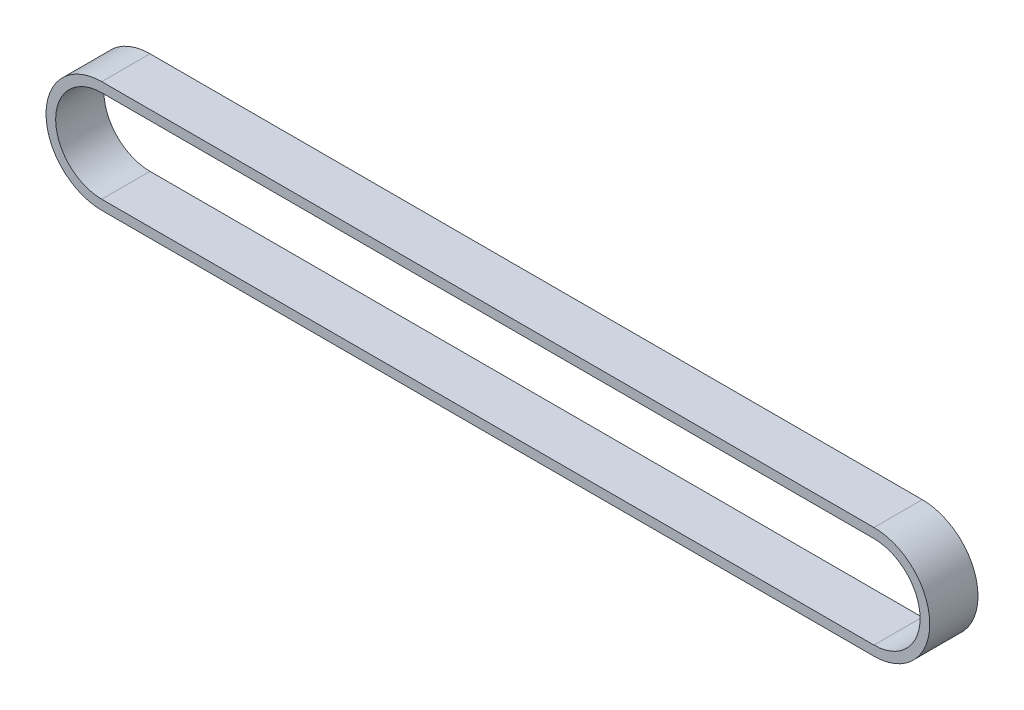
ISO-10303-21;
HEADER;
FILE_DESCRIPTION(('STEP AP214'),'2;1');
FILE_NAME('part.step','',(''),(''),'','','');
FILE_SCHEMA(('AUTOMOTIVE_DESIGN { 1 0 10303 214 1 1 1 1 }'));
ENDSEC;
DATA;
#1=APPLICATION_CONTEXT('core data for automotive mechanical design processes');
#2=APPLICATION_PROTOCOL_DEFINITION('international standard','automotive_design',2000,#1);
#3=PRODUCT_CONTEXT('',#1,'mechanical');
#4=PRODUCT('Part','Part','',(#3));
#5=PRODUCT_RELATED_PRODUCT_CATEGORY('part','',(#4));
#6=PRODUCT_DEFINITION_FORMATION('','',#4);
#7=PRODUCT_DEFINITION_CONTEXT('part definition',#1,'design');
#8=PRODUCT_DEFINITION('design','',#6,#7);
#9=PRODUCT_DEFINITION_SHAPE('','',#8);
#10=(LENGTH_UNIT() NAMED_UNIT(*) SI_UNIT(.MILLI.,.METRE.));
#11=(NAMED_UNIT(*) PLANE_ANGLE_UNIT() SI_UNIT($,.RADIAN.));
#12=(NAMED_UNIT(*) SI_UNIT($,.STERADIAN.) SOLID_ANGLE_UNIT());
#13=UNCERTAINTY_MEASURE_WITH_UNIT(LENGTH_MEASURE(1.E-05),#10,'distance_accuracy_value','');
#14=(GEOMETRIC_REPRESENTATION_CONTEXT(3) GLOBAL_UNCERTAINTY_ASSIGNED_CONTEXT((#13)) GLOBAL_UNIT_ASSIGNED_CONTEXT((#10,
#11,#12)) REPRESENTATION_CONTEXT('',''));
#15=CARTESIAN_POINT('',(0.,0.,0.));
#16=DIRECTION('',(0.,0.,1.));
#17=DIRECTION('',(1.,0.,0.));
#18=AXIS2_PLACEMENT_3D('',#15,#16,#17);
#19=CARTESIAN_POINT('',(0.,0.,7.5));
#20=DIRECTION('',(0.,0.,-1.));
#21=DIRECTION('',(-1.,0.,0.));
#22=AXIS2_PLACEMENT_3D('',#19,#20,#21);
#23=PLANE('',#22);
#24=CARTESIAN_POINT('',(0.,0.,7.5));
#25=DIRECTION('',(0.,0.,-1.));
#26=DIRECTION('',(-1.,0.,0.));
#27=AXIS2_PLACEMENT_3D('',#24,#25,#26);
#28=CIRCLE('',#27,17.325);
#29=CARTESIAN_POINT('',(0.,17.325,7.5));
#30=VERTEX_POINT('',#29);
#31=CARTESIAN_POINT('',(0.,-17.325,7.5));
#32=VERTEX_POINT('',#31);
#33=EDGE_CURVE('E181',#30,#32,#28,.F.);
#34=ORIENTED_EDGE('',*,*,#33,.T.);
#35=DIRECTION('',(1.,0.,0.));
#36=VECTOR('',#35,1.);
#37=CARTESIAN_POINT('',(0.,-17.325,7.5));
#38=LINE('',#37,#36);
#39=CARTESIAN_POINT('',(239.996685237326,-17.3249999999996,7.5));
#40=VERTEX_POINT('',#39);
#41=EDGE_CURVE('E185',#32,#40,#38,.T.);
#42=ORIENTED_EDGE('',*,*,#41,.T.);
#43=CARTESIAN_POINT('',(239.996685237326,3.78470161803052E-13,7.5));
#44=DIRECTION('',(0.,0.,-1.));
#45=DIRECTION('',(-1.,0.,0.));
#46=AXIS2_PLACEMENT_3D('',#43,#44,#45);
#47=CIRCLE('',#46,17.325);
#48=CARTESIAN_POINT('',(239.996685237326,17.3250000000004,7.5));
#49=VERTEX_POINT('',#48);
#50=EDGE_CURVE('E188',#40,#49,#47,.F.);
#51=ORIENTED_EDGE('',*,*,#50,.T.);
#52=DIRECTION('',(-1.,0.,0.));
#53=VECTOR('',#52,1.);
#54=CARTESIAN_POINT('',(0.,17.325,7.5));
#55=LINE('',#54,#53);
#56=EDGE_CURVE('E190',#49,#30,#55,.T.);
#57=ORIENTED_EDGE('',*,*,#56,.T.);
#58=EDGE_LOOP('',(#34,#42,#51,#57));
#59=FACE_BOUND('',#58,.T.);
#60=CARTESIAN_POINT('',(0.,0.,7.5));
#61=DIRECTION('',(0.,0.,1.));
#62=DIRECTION('',(-1.,0.,0.));
#63=AXIS2_PLACEMENT_3D('',#60,#61,#62);
#64=CIRCLE('',#63,14.325);
#65=CARTESIAN_POINT('',(0.,14.325,7.5));
#66=VERTEX_POINT('',#65);
#67=CARTESIAN_POINT('',(0.,-14.325,7.5));
#68=VERTEX_POINT('',#67);
#69=EDGE_CURVE('E137',#66,#68,#64,.T.);
#70=ORIENTED_EDGE('',*,*,#69,.F.);
#71=DIRECTION('',(-1.,0.,0.));
#72=VECTOR('',#71,1.);
#73=CARTESIAN_POINT('',(0.,14.325,7.5));
#74=LINE('',#73,#72);
#75=CARTESIAN_POINT('',(239.996685237326,14.3250000000004,7.5));
#76=VERTEX_POINT('',#75);
#77=EDGE_CURVE('E163',#76,#66,#74,.T.);
#78=ORIENTED_EDGE('',*,*,#77,.F.);
#79=CARTESIAN_POINT('',(239.996685237326,3.78470161803052E-13,7.5));
#80=DIRECTION('',(0.,0.,1.));
#81=DIRECTION('',(-1.,0.,0.));
#82=AXIS2_PLACEMENT_3D('',#79,#80,#81);
#83=CIRCLE('',#82,14.325);
#84=CARTESIAN_POINT('',(239.996685237326,-14.3249999999996,7.5));
#85=VERTEX_POINT('',#84);
#86=EDGE_CURVE('E159',#85,#76,#83,.T.);
#87=ORIENTED_EDGE('',*,*,#86,.F.);
#88=DIRECTION('',(1.,0.,0.));
#89=VECTOR('',#88,1.);
#90=CARTESIAN_POINT('',(239.996685237326,-14.3249999999996,7.5));
#91=LINE('',#90,#89);
#92=EDGE_CURVE('E146',#68,#85,#91,.T.);
#93=ORIENTED_EDGE('',*,*,#92,.F.);
#94=EDGE_LOOP('',(#70,#78,#87,#93));
#95=FACE_BOUND('',#94,.T.);
#96=ADVANCED_FACE('F67',(#59,#95),#23,.F.);
#97=CARTESIAN_POINT('',(0.,0.,-7.5));
#98=DIRECTION('',(0.,0.,-1.));
#99=DIRECTION('',(-1.,0.,0.));
#100=AXIS2_PLACEMENT_3D('',#97,#98,#99);
#101=PLANE('',#100);
#102=CARTESIAN_POINT('',(0.,0.,-7.5));
#103=DIRECTION('',(0.,0.,-1.));
#104=DIRECTION('',(-1.,0.,0.));
#105=AXIS2_PLACEMENT_3D('',#102,#103,#104);
#106=CIRCLE('',#105,17.325);
#107=CARTESIAN_POINT('',(0.,17.325,-7.5));
#108=VERTEX_POINT('',#107);
#109=CARTESIAN_POINT('',(0.,-17.325,-7.5));
#110=VERTEX_POINT('',#109);
#111=EDGE_CURVE('E155',#108,#110,#106,.F.);
#112=ORIENTED_EDGE('',*,*,#111,.F.);
#113=DIRECTION('',(-1.,0.,0.));
#114=VECTOR('',#113,1.);
#115=CARTESIAN_POINT('',(0.,17.325,-7.5));
#116=LINE('',#115,#114);
#117=CARTESIAN_POINT('',(239.996685237326,17.3250000000004,-7.5));
#118=VERTEX_POINT('',#117);
#119=EDGE_CURVE('E186',#118,#108,#116,.T.);
#120=ORIENTED_EDGE('',*,*,#119,.F.);
#121=CARTESIAN_POINT('',(239.996685237326,3.78470161803052E-13,-7.5));
#122=DIRECTION('',(0.,0.,-1.));
#123=DIRECTION('',(-1.,0.,0.));
#124=AXIS2_PLACEMENT_3D('',#121,#122,#123);
#125=CIRCLE('',#124,17.325);
#126=CARTESIAN_POINT('',(239.996685237326,-17.3249999999996,-7.5));
#127=VERTEX_POINT('',#126);
#128=EDGE_CURVE('E200',#127,#118,#125,.F.);
#129=ORIENTED_EDGE('',*,*,#128,.F.);
#130=DIRECTION('',(1.,0.,0.));
#131=VECTOR('',#130,1.);
#132=CARTESIAN_POINT('',(0.,-17.325,-7.5));
#133=LINE('',#132,#131);
#134=EDGE_CURVE('E197',#110,#127,#133,.T.);
#135=ORIENTED_EDGE('',*,*,#134,.F.);
#136=EDGE_LOOP('',(#112,#120,#129,#135));
#137=FACE_BOUND('',#136,.T.);
#138=DIRECTION('',(-1.,0.,0.));
#139=VECTOR('',#138,1.);
#140=CARTESIAN_POINT('',(0.,14.325,-7.5));
#141=LINE('',#140,#139);
#142=CARTESIAN_POINT('',(239.996685237326,14.3250000000004,-7.5));
#143=VERTEX_POINT('',#142);
#144=CARTESIAN_POINT('',(0.,14.325,-7.5));
#145=VERTEX_POINT('',#144);
#146=EDGE_CURVE('E147',#143,#145,#141,.T.);
#147=ORIENTED_EDGE('',*,*,#146,.T.);
#148=CARTESIAN_POINT('',(0.,0.,-7.5));
#149=DIRECTION('',(0.,0.,1.));
#150=DIRECTION('',(-1.,0.,0.));
#151=AXIS2_PLACEMENT_3D('',#148,#149,#150);
#152=CIRCLE('',#151,14.325);
#153=CARTESIAN_POINT('',(0.,-14.325,-7.5));
#154=VERTEX_POINT('',#153);
#155=EDGE_CURVE('E91',#145,#154,#152,.T.);
#156=ORIENTED_EDGE('',*,*,#155,.T.);
#157=DIRECTION('',(1.,0.,0.));
#158=VECTOR('',#157,1.);
#159=CARTESIAN_POINT('',(239.996685237326,-14.3249999999996,-7.5));
#160=LINE('',#159,#158);
#161=CARTESIAN_POINT('',(239.996685237326,-14.3249999999996,-7.5));
#162=VERTEX_POINT('',#161);
#163=EDGE_CURVE('E153',#154,#162,#160,.T.);
#164=ORIENTED_EDGE('',*,*,#163,.T.);
#165=CARTESIAN_POINT('',(239.996685237326,3.78470161803052E-13,-7.5));
#166=DIRECTION('',(0.,0.,1.));
#167=DIRECTION('',(-1.,0.,0.));
#168=AXIS2_PLACEMENT_3D('',#165,#166,#167);
#169=CIRCLE('',#168,14.325);
#170=EDGE_CURVE('E172',#162,#143,#169,.T.);
#171=ORIENTED_EDGE('',*,*,#170,.T.);
#172=EDGE_LOOP('',(#147,#156,#164,#171));
#173=FACE_BOUND('',#172,.T.);
#174=ADVANCED_FACE('F218',(#137,#173),#101,.T.);
#175=CARTESIAN_POINT('',(0.,0.,7.5));
#176=DIRECTION('',(0.,0.,-1.));
#177=DIRECTION('',(-1.,0.,0.));
#178=AXIS2_PLACEMENT_3D('',#175,#176,#177);
#179=CYLINDRICAL_SURFACE('',#178,17.325);
#180=ORIENTED_EDGE('',*,*,#111,.T.);
#181=DIRECTION('',(0.,0.,-1.));
#182=VECTOR('',#181,1.);
#183=CARTESIAN_POINT('',(0.,-17.325,7.5));
#184=LINE('',#183,#182);
#185=EDGE_CURVE('E12',#32,#110,#184,.T.);
#186=ORIENTED_EDGE('',*,*,#185,.F.);
#187=ORIENTED_EDGE('',*,*,#33,.F.);
#188=DIRECTION('',(0.,0.,-1.));
#189=VECTOR('',#188,1.);
#190=CARTESIAN_POINT('',(0.,17.325,7.5));
#191=LINE('',#190,#189);
#192=EDGE_CURVE('E193',#30,#108,#191,.T.);
#193=ORIENTED_EDGE('',*,*,#192,.T.);
#194=EDGE_LOOP('',(#180,#186,#187,#193));
#195=FACE_BOUND('',#194,.T.);
#196=ADVANCED_FACE('F69',(#195),#179,.T.);
#197=CARTESIAN_POINT('',(0.,-17.325,7.5));
#198=DIRECTION('',(0.,1.,0.));
#199=DIRECTION('',(-1.,0.,0.));
#200=AXIS2_PLACEMENT_3D('',#197,#198,#199);
#201=PLANE('',#200);
#202=ORIENTED_EDGE('',*,*,#134,.T.);
#203=DIRECTION('',(0.,0.,-1.));
#204=VECTOR('',#203,1.);
#205=CARTESIAN_POINT('',(239.996685237326,-17.3249999999996,7.5));
#206=LINE('',#205,#204);
#207=EDGE_CURVE('E76',#40,#127,#206,.T.);
#208=ORIENTED_EDGE('',*,*,#207,.F.);
#209=ORIENTED_EDGE('',*,*,#41,.F.);
#210=ORIENTED_EDGE('',*,*,#185,.T.);
#211=EDGE_LOOP('',(#202,#208,#209,#210));
#212=FACE_BOUND('',#211,.T.);
#213=ADVANCED_FACE('F228',(#212),#201,.F.);
#214=CARTESIAN_POINT('',(239.996685237326,3.78470161803052E-13,7.5));
#215=DIRECTION('',(0.,0.,-1.));
#216=DIRECTION('',(-1.,0.,0.));
#217=AXIS2_PLACEMENT_3D('',#214,#215,#216);
#218=CYLINDRICAL_SURFACE('',#217,17.325);
#219=ORIENTED_EDGE('',*,*,#128,.T.);
#220=DIRECTION('',(0.,0.,-1.));
#221=VECTOR('',#220,1.);
#222=CARTESIAN_POINT('',(239.996685237326,17.3250000000004,7.5));
#223=LINE('',#222,#221);
#224=EDGE_CURVE('E205',#49,#118,#223,.T.);
#225=ORIENTED_EDGE('',*,*,#224,.F.);
#226=ORIENTED_EDGE('',*,*,#50,.F.);
#227=ORIENTED_EDGE('',*,*,#207,.T.);
#228=EDGE_LOOP('',(#219,#225,#226,#227));
#229=FACE_BOUND('',#228,.T.);
#230=ADVANCED_FACE('F212',(#229),#218,.T.);
#231=CARTESIAN_POINT('',(0.,17.325,7.5));
#232=DIRECTION('',(0.,-1.,0.));
#233=DIRECTION('',(1.,0.,0.));
#234=AXIS2_PLACEMENT_3D('',#231,#232,#233);
#235=PLANE('',#234);
#236=ORIENTED_EDGE('',*,*,#119,.T.);
#237=ORIENTED_EDGE('',*,*,#192,.F.);
#238=ORIENTED_EDGE('',*,*,#56,.F.);
#239=ORIENTED_EDGE('',*,*,#224,.T.);
#240=EDGE_LOOP('',(#236,#237,#238,#239));
#241=FACE_BOUND('',#240,.T.);
#242=ADVANCED_FACE('F222',(#241),#235,.F.);
#243=CARTESIAN_POINT('',(0.,0.,7.5));
#244=DIRECTION('',(0.,0.,-1.));
#245=DIRECTION('',(-1.,0.,0.));
#246=AXIS2_PLACEMENT_3D('',#243,#244,#245);
#247=CYLINDRICAL_SURFACE('',#246,14.325);
#248=ORIENTED_EDGE('',*,*,#155,.F.);
#249=DIRECTION('',(0.,0.,-1.));
#250=VECTOR('',#249,1.);
#251=CARTESIAN_POINT('',(0.,14.325,7.5));
#252=LINE('',#251,#250);
#253=EDGE_CURVE('E141',#66,#145,#252,.T.);
#254=ORIENTED_EDGE('',*,*,#253,.F.);
#255=ORIENTED_EDGE('',*,*,#69,.T.);
#256=DIRECTION('',(0.,0.,-1.));
#257=VECTOR('',#256,1.);
#258=CARTESIAN_POINT('',(0.,-14.325,7.5));
#259=LINE('',#258,#257);
#260=EDGE_CURVE('E140',#68,#154,#259,.T.);
#261=ORIENTED_EDGE('',*,*,#260,.T.);
#262=EDGE_LOOP('',(#248,#254,#255,#261));
#263=FACE_BOUND('',#262,.T.);
#264=ADVANCED_FACE('F139',(#263),#247,.F.);
#265=CARTESIAN_POINT('',(239.996685237326,-14.3249999999996,7.5));
#266=DIRECTION('',(0.,1.,0.));
#267=DIRECTION('',(-1.,0.,0.));
#268=AXIS2_PLACEMENT_3D('',#265,#266,#267);
#269=PLANE('',#268);
#270=ORIENTED_EDGE('',*,*,#163,.F.);
#271=ORIENTED_EDGE('',*,*,#260,.F.);
#272=ORIENTED_EDGE('',*,*,#92,.T.);
#273=DIRECTION('',(0.,0.,-1.));
#274=VECTOR('',#273,1.);
#275=CARTESIAN_POINT('',(239.996685237326,-14.3249999999996,7.5));
#276=LINE('',#275,#274);
#277=EDGE_CURVE('E156',#85,#162,#276,.T.);
#278=ORIENTED_EDGE('',*,*,#277,.T.);
#279=EDGE_LOOP('',(#270,#271,#272,#278));
#280=FACE_BOUND('',#279,.T.);
#281=ADVANCED_FACE('F150',(#280),#269,.T.);
#282=CARTESIAN_POINT('',(239.996685237326,3.78470161803052E-13,7.5));
#283=DIRECTION('',(0.,0.,-1.));
#284=DIRECTION('',(-1.,0.,0.));
#285=AXIS2_PLACEMENT_3D('',#282,#283,#284);
#286=CYLINDRICAL_SURFACE('',#285,14.325);
#287=ORIENTED_EDGE('',*,*,#170,.F.);
#288=ORIENTED_EDGE('',*,*,#277,.F.);
#289=ORIENTED_EDGE('',*,*,#86,.T.);
#290=DIRECTION('',(0.,0.,-1.));
#291=VECTOR('',#290,1.);
#292=CARTESIAN_POINT('',(239.996685237326,14.3250000000004,7.5));
#293=LINE('',#292,#291);
#294=EDGE_CURVE('E83',#76,#143,#293,.T.);
#295=ORIENTED_EDGE('',*,*,#294,.T.);
#296=EDGE_LOOP('',(#287,#288,#289,#295));
#297=FACE_BOUND('',#296,.T.);
#298=ADVANCED_FACE('F251',(#297),#286,.F.);
#299=CARTESIAN_POINT('',(0.,14.325,7.5));
#300=DIRECTION('',(0.,-1.,0.));
#301=DIRECTION('',(1.,0.,0.));
#302=AXIS2_PLACEMENT_3D('',#299,#300,#301);
#303=PLANE('',#302);
#304=ORIENTED_EDGE('',*,*,#146,.F.);
#305=ORIENTED_EDGE('',*,*,#294,.F.);
#306=ORIENTED_EDGE('',*,*,#77,.T.);
#307=ORIENTED_EDGE('',*,*,#253,.T.);
#308=EDGE_LOOP('',(#304,#305,#306,#307));
#309=FACE_BOUND('',#308,.T.);
#310=ADVANCED_FACE('F255',(#309),#303,.T.);
#311=CLOSED_SHELL('',(#96,#174,#196,#213,#230,#242,#264,#281,#298,#310));
#312=MANIFOLD_SOLID_BREP('B2',#311);
#313=ADVANCED_BREP_SHAPE_REPRESENTATION('',(#18,#312),#14);
#314=SHAPE_DEFINITION_REPRESENTATION(#9,#313);
ENDSEC;
END-ISO-10303-21;
